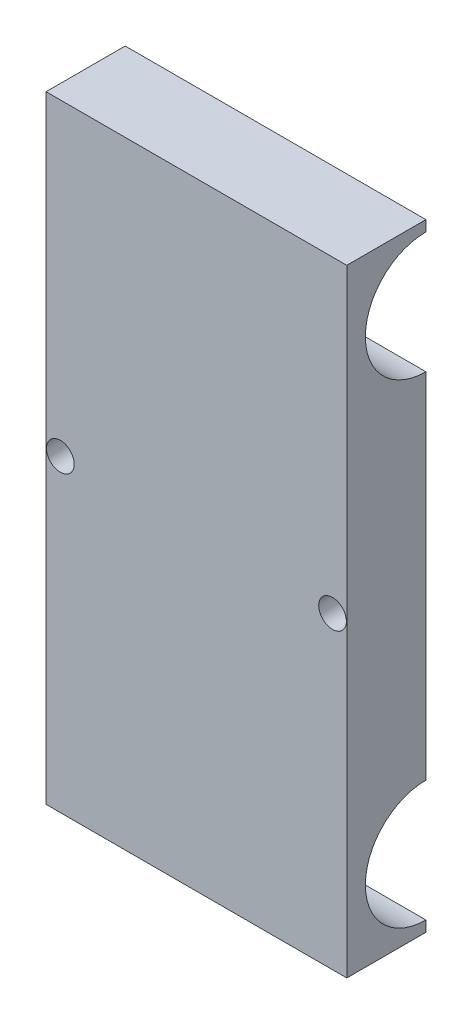
ISO-10303-21;
HEADER;
FILE_DESCRIPTION(('STEP AP214'),'2;1');
FILE_NAME('part.step','',(''),(''),'','','');
FILE_SCHEMA(('AUTOMOTIVE_DESIGN { 1 0 10303 214 1 1 1 1 }'));
ENDSEC;
DATA;
#1=APPLICATION_CONTEXT('core data for automotive mechanical design processes');
#2=APPLICATION_PROTOCOL_DEFINITION('international standard','automotive_design',2000,#1);
#3=PRODUCT_CONTEXT('',#1,'mechanical');
#4=PRODUCT('Part','Part','',(#3));
#5=PRODUCT_RELATED_PRODUCT_CATEGORY('part','',(#4));
#6=PRODUCT_DEFINITION_FORMATION('','',#4);
#7=PRODUCT_DEFINITION_CONTEXT('part definition',#1,'design');
#8=PRODUCT_DEFINITION('design','',#6,#7);
#9=PRODUCT_DEFINITION_SHAPE('','',#8);
#10=(LENGTH_UNIT() NAMED_UNIT(*) SI_UNIT(.MILLI.,.METRE.));
#11=(NAMED_UNIT(*) PLANE_ANGLE_UNIT() SI_UNIT($,.RADIAN.));
#12=(NAMED_UNIT(*) SI_UNIT($,.STERADIAN.) SOLID_ANGLE_UNIT());
#13=UNCERTAINTY_MEASURE_WITH_UNIT(LENGTH_MEASURE(1.E-05),#10,'distance_accuracy_value','');
#14=(GEOMETRIC_REPRESENTATION_CONTEXT(3) GLOBAL_UNCERTAINTY_ASSIGNED_CONTEXT((#13)) GLOBAL_UNIT_ASSIGNED_CONTEXT((#10,
#11,#12)) REPRESENTATION_CONTEXT('',''));
#15=CARTESIAN_POINT('',(0.,0.,0.));
#16=DIRECTION('',(0.,0.,1.));
#17=DIRECTION('',(1.,0.,0.));
#18=AXIS2_PLACEMENT_3D('',#15,#16,#17);
#19=CARTESIAN_POINT('',(0.,0.,0.));
#20=DIRECTION('',(0.,0.,-1.));
#21=DIRECTION('',(-1.,0.,0.));
#22=AXIS2_PLACEMENT_3D('',#19,#20,#21);
#23=PLANE('',#22);
#24=DIRECTION('',(-1.,0.,0.));
#25=VECTOR('',#24,1.);
#26=CARTESIAN_POINT('',(38.,1.35,0.));
#27=LINE('',#26,#25);
#28=CARTESIAN_POINT('',(38.,1.35,0.));
#29=VERTEX_POINT('',#28);
#30=CARTESIAN_POINT('',(0.,1.35,0.));
#31=VERTEX_POINT('',#30);
#32=EDGE_CURVE('E96',#29,#31,#27,.T.);
#33=ORIENTED_EDGE('',*,*,#32,.F.);
#34=DIRECTION('',(0.,1.,0.));
#35=VECTOR('',#34,1.);
#36=CARTESIAN_POINT('',(38.,0.,0.));
#37=LINE('',#36,#35);
#38=CARTESIAN_POINT('',(38.,0.,0.));
#39=VERTEX_POINT('',#38);
#40=EDGE_CURVE('E105',#39,#29,#37,.T.);
#41=ORIENTED_EDGE('',*,*,#40,.F.);
#42=DIRECTION('',(1.,0.,0.));
#43=VECTOR('',#42,1.);
#44=CARTESIAN_POINT('',(0.,0.,0.));
#45=LINE('',#44,#43);
#46=CARTESIAN_POINT('',(0.,0.,0.));
#47=VERTEX_POINT('',#46);
#48=EDGE_CURVE('E120',#47,#39,#45,.T.);
#49=ORIENTED_EDGE('',*,*,#48,.F.);
#50=DIRECTION('',(0.,-1.,0.));
#51=VECTOR('',#50,1.);
#52=CARTESIAN_POINT('',(0.,0.,0.));
#53=LINE('',#52,#51);
#54=EDGE_CURVE('E106',#31,#47,#53,.T.);
#55=ORIENTED_EDGE('',*,*,#54,.F.);
#56=EDGE_LOOP('',(#33,#41,#49,#55));
#57=FACE_BOUND('',#56,.T.);
#58=ADVANCED_FACE('F33',(#57),#23,.T.);
#59=CARTESIAN_POINT('',(1.8,39.,0.));
#60=DIRECTION('',(0.,0.,-1.));
#61=DIRECTION('',(-1.,0.,0.));
#62=AXIS2_PLACEMENT_3D('',#59,#60,#61);
#63=CIRCLE('',#62,1.75);
#64=CARTESIAN_POINT('',(0.0499999999999962,39.,0.));
#65=VERTEX_POINT('',#64);
#66=EDGE_CURVE('E154',#65,#65,#63,.T.);
#67=ORIENTED_EDGE('',*,*,#66,.F.);
#68=EDGE_LOOP('',(#67));
#69=FACE_BOUND('',#68,.T.);
#70=CARTESIAN_POINT('',(36.2,39.,0.));
#71=DIRECTION('',(0.,0.,-1.));
#72=DIRECTION('',(-1.,0.,0.));
#73=AXIS2_PLACEMENT_3D('',#70,#71,#72);
#74=CIRCLE('',#73,1.75);
#75=CARTESIAN_POINT('',(34.45,39.,0.));
#76=VERTEX_POINT('',#75);
#77=EDGE_CURVE('E148',#76,#76,#74,.T.);
#78=ORIENTED_EDGE('',*,*,#77,.F.);
#79=EDGE_LOOP('',(#78));
#80=FACE_BOUND('',#79,.T.);
#81=DIRECTION('',(-1.,0.,0.));
#82=VECTOR('',#81,1.);
#83=CARTESIAN_POINT('',(38.,16.65,0.));
#84=LINE('',#83,#82);
#85=CARTESIAN_POINT('',(0.,16.65,0.));
#86=VERTEX_POINT('',#85);
#87=CARTESIAN_POINT('',(38.,16.65,0.));
#88=VERTEX_POINT('',#87);
#89=EDGE_CURVE('E48',#86,#88,#84,.F.);
#90=ORIENTED_EDGE('',*,*,#89,.F.);
#91=CARTESIAN_POINT('',(0.,61.35,0.));
#92=VERTEX_POINT('',#91);
#93=EDGE_CURVE('E129',#92,#86,#53,.T.);
#94=ORIENTED_EDGE('',*,*,#93,.F.);
#95=DIRECTION('',(-1.,0.,0.));
#96=VECTOR('',#95,1.);
#97=CARTESIAN_POINT('',(38.,61.35,0.));
#98=LINE('',#97,#96);
#99=CARTESIAN_POINT('',(38.,61.35,0.));
#100=VERTEX_POINT('',#99);
#101=EDGE_CURVE('E41',#100,#92,#98,.T.);
#102=ORIENTED_EDGE('',*,*,#101,.F.);
#103=EDGE_CURVE('E114',#88,#100,#37,.T.);
#104=ORIENTED_EDGE('',*,*,#103,.F.);
#105=EDGE_LOOP('',(#90,#94,#102,#104));
#106=FACE_BOUND('',#105,.T.);
#107=ADVANCED_FACE('F170',(#69,#80,#106),#23,.T.);
#108=CARTESIAN_POINT('',(0.,0.,10.));
#109=DIRECTION('',(1.,0.,0.));
#110=DIRECTION('',(0.,0.,-1.));
#111=AXIS2_PLACEMENT_3D('',#108,#109,#110);
#112=PLANE('',#111);
#113=ORIENTED_EDGE('',*,*,#93,.T.);
#114=CARTESIAN_POINT('',(0.,9.,0.));
#115=DIRECTION('',(-1.,0.,0.));
#116=DIRECTION('',(0.,0.,1.));
#117=AXIS2_PLACEMENT_3D('',#114,#115,#116);
#118=CIRCLE('',#117,7.65);
#119=EDGE_CURVE('E145',#31,#86,#118,.T.);
#120=ORIENTED_EDGE('',*,*,#119,.F.);
#121=ORIENTED_EDGE('',*,*,#54,.T.);
#122=DIRECTION('',(0.,0.,-1.));
#123=VECTOR('',#122,1.);
#124=CARTESIAN_POINT('',(0.,0.,10.));
#125=LINE('',#124,#123);
#126=CARTESIAN_POINT('',(0.,0.,10.));
#127=VERTEX_POINT('',#126);
#128=EDGE_CURVE('E183',#127,#47,#125,.T.);
#129=ORIENTED_EDGE('',*,*,#128,.F.);
#130=DIRECTION('',(0.,-1.,0.));
#131=VECTOR('',#130,1.);
#132=CARTESIAN_POINT('',(0.,0.,10.));
#133=LINE('',#132,#131);
#134=CARTESIAN_POINT('',(0.,78.,10.));
#135=VERTEX_POINT('',#134);
#136=EDGE_CURVE('E117',#135,#127,#133,.T.);
#137=ORIENTED_EDGE('',*,*,#136,.F.);
#138=DIRECTION('',(0.,0.,-1.));
#139=VECTOR('',#138,1.);
#140=CARTESIAN_POINT('',(0.,78.,10.));
#141=LINE('',#140,#139);
#142=CARTESIAN_POINT('',(0.,78.,0.));
#143=VERTEX_POINT('',#142);
#144=EDGE_CURVE('E134',#135,#143,#141,.T.);
#145=ORIENTED_EDGE('',*,*,#144,.T.);
#146=CARTESIAN_POINT('',(0.,76.65,0.));
#147=VERTEX_POINT('',#146);
#148=EDGE_CURVE('E125',#143,#147,#53,.T.);
#149=ORIENTED_EDGE('',*,*,#148,.T.);
#150=CARTESIAN_POINT('',(0.,69.,0.));
#151=DIRECTION('',(-1.,0.,0.));
#152=DIRECTION('',(0.,0.,1.));
#153=AXIS2_PLACEMENT_3D('',#150,#151,#152);
#154=CIRCLE('',#153,7.65);
#155=EDGE_CURVE('E55',#92,#147,#154,.T.);
#156=ORIENTED_EDGE('',*,*,#155,.F.);
#157=EDGE_LOOP('',(#113,#120,#121,#129,#137,#145,#149,#156));
#158=FACE_BOUND('',#157,.T.);
#159=ADVANCED_FACE('F35',(#158),#112,.F.);
#160=CARTESIAN_POINT('',(0.,0.,10.));
#161=DIRECTION('',(0.,1.,0.));
#162=DIRECTION('',(0.,0.,1.));
#163=AXIS2_PLACEMENT_3D('',#160,#161,#162);
#164=PLANE('',#163);
#165=ORIENTED_EDGE('',*,*,#48,.T.);
#166=DIRECTION('',(0.,0.,-1.));
#167=VECTOR('',#166,1.);
#168=CARTESIAN_POINT('',(38.,0.,10.));
#169=LINE('',#168,#167);
#170=CARTESIAN_POINT('',(38.,0.,10.));
#171=VERTEX_POINT('',#170);
#172=EDGE_CURVE('E112',#171,#39,#169,.T.);
#173=ORIENTED_EDGE('',*,*,#172,.F.);
#174=DIRECTION('',(1.,0.,0.));
#175=VECTOR('',#174,1.);
#176=CARTESIAN_POINT('',(0.,0.,10.));
#177=LINE('',#176,#175);
#178=EDGE_CURVE('E137',#127,#171,#177,.T.);
#179=ORIENTED_EDGE('',*,*,#178,.F.);
#180=ORIENTED_EDGE('',*,*,#128,.T.);
#181=EDGE_LOOP('',(#165,#173,#179,#180));
#182=FACE_BOUND('',#181,.T.);
#183=ADVANCED_FACE('F184',(#182),#164,.F.);
#184=CARTESIAN_POINT('',(38.,0.,10.));
#185=DIRECTION('',(-1.,0.,0.));
#186=DIRECTION('',(0.,0.,1.));
#187=AXIS2_PLACEMENT_3D('',#184,#185,#186);
#188=PLANE('',#187);
#189=ORIENTED_EDGE('',*,*,#40,.T.);
#190=CARTESIAN_POINT('',(38.,9.,0.));
#191=DIRECTION('',(-1.,0.,0.));
#192=DIRECTION('',(0.,0.,1.));
#193=AXIS2_PLACEMENT_3D('',#190,#191,#192);
#194=CIRCLE('',#193,7.65);
#195=EDGE_CURVE('E11',#29,#88,#194,.T.);
#196=ORIENTED_EDGE('',*,*,#195,.T.);
#197=ORIENTED_EDGE('',*,*,#103,.T.);
#198=CARTESIAN_POINT('',(38.,69.,0.));
#199=DIRECTION('',(-1.,0.,0.));
#200=DIRECTION('',(0.,0.,1.));
#201=AXIS2_PLACEMENT_3D('',#198,#199,#200);
#202=CIRCLE('',#201,7.65);
#203=CARTESIAN_POINT('',(38.,76.65,0.));
#204=VERTEX_POINT('',#203);
#205=EDGE_CURVE('E142',#100,#204,#202,.T.);
#206=ORIENTED_EDGE('',*,*,#205,.T.);
#207=CARTESIAN_POINT('',(38.,78.,0.));
#208=VERTEX_POINT('',#207);
#209=EDGE_CURVE('E116',#204,#208,#37,.T.);
#210=ORIENTED_EDGE('',*,*,#209,.T.);
#211=DIRECTION('',(0.,0.,-1.));
#212=VECTOR('',#211,1.);
#213=CARTESIAN_POINT('',(38.,78.,10.));
#214=LINE('',#213,#212);
#215=CARTESIAN_POINT('',(38.,78.,10.));
#216=VERTEX_POINT('',#215);
#217=EDGE_CURVE('E188',#216,#208,#214,.T.);
#218=ORIENTED_EDGE('',*,*,#217,.F.);
#219=DIRECTION('',(0.,1.,0.));
#220=VECTOR('',#219,1.);
#221=CARTESIAN_POINT('',(38.,0.,10.));
#222=LINE('',#221,#220);
#223=EDGE_CURVE('E135',#171,#216,#222,.T.);
#224=ORIENTED_EDGE('',*,*,#223,.F.);
#225=ORIENTED_EDGE('',*,*,#172,.T.);
#226=EDGE_LOOP('',(#189,#196,#197,#206,#210,#218,#224,#225));
#227=FACE_BOUND('',#226,.T.);
#228=ADVANCED_FACE('F109',(#227),#188,.F.);
#229=CARTESIAN_POINT('',(0.,78.,10.));
#230=DIRECTION('',(0.,-1.,0.));
#231=DIRECTION('',(0.,0.,-1.));
#232=AXIS2_PLACEMENT_3D('',#229,#230,#231);
#233=PLANE('',#232);
#234=DIRECTION('',(-1.,0.,0.));
#235=VECTOR('',#234,1.);
#236=CARTESIAN_POINT('',(0.,78.,0.));
#237=LINE('',#236,#235);
#238=EDGE_CURVE('E113',#208,#143,#237,.T.);
#239=ORIENTED_EDGE('',*,*,#238,.T.);
#240=ORIENTED_EDGE('',*,*,#144,.F.);
#241=DIRECTION('',(-1.,0.,0.));
#242=VECTOR('',#241,1.);
#243=CARTESIAN_POINT('',(0.,78.,10.));
#244=LINE('',#243,#242);
#245=EDGE_CURVE('E132',#216,#135,#244,.T.);
#246=ORIENTED_EDGE('',*,*,#245,.F.);
#247=ORIENTED_EDGE('',*,*,#217,.T.);
#248=EDGE_LOOP('',(#239,#240,#246,#247));
#249=FACE_BOUND('',#248,.T.);
#250=ADVANCED_FACE('F199',(#249),#233,.F.);
#251=CARTESIAN_POINT('',(0.,0.,10.));
#252=DIRECTION('',(0.,0.,-1.));
#253=DIRECTION('',(-1.,0.,0.));
#254=AXIS2_PLACEMENT_3D('',#251,#252,#253);
#255=PLANE('',#254);
#256=CARTESIAN_POINT('',(1.8,39.,10.));
#257=DIRECTION('',(0.,0.,-1.));
#258=DIRECTION('',(-1.,0.,0.));
#259=AXIS2_PLACEMENT_3D('',#256,#257,#258);
#260=CIRCLE('',#259,1.75);
#261=CARTESIAN_POINT('',(0.0499999999999962,39.,10.));
#262=VERTEX_POINT('',#261);
#263=EDGE_CURVE('E151',#262,#262,#260,.T.);
#264=ORIENTED_EDGE('',*,*,#263,.T.);
#265=EDGE_LOOP('',(#264));
#266=FACE_BOUND('',#265,.T.);
#267=CARTESIAN_POINT('',(36.2,39.,10.));
#268=DIRECTION('',(0.,0.,-1.));
#269=DIRECTION('',(-1.,0.,0.));
#270=AXIS2_PLACEMENT_3D('',#267,#268,#269);
#271=CIRCLE('',#270,1.75);
#272=CARTESIAN_POINT('',(34.45,39.,10.));
#273=VERTEX_POINT('',#272);
#274=EDGE_CURVE('E147',#273,#273,#271,.T.);
#275=ORIENTED_EDGE('',*,*,#274,.T.);
#276=EDGE_LOOP('',(#275));
#277=FACE_BOUND('',#276,.T.);
#278=ORIENTED_EDGE('',*,*,#136,.T.);
#279=ORIENTED_EDGE('',*,*,#178,.T.);
#280=ORIENTED_EDGE('',*,*,#223,.T.);
#281=ORIENTED_EDGE('',*,*,#245,.T.);
#282=EDGE_LOOP('',(#278,#279,#280,#281));
#283=FACE_BOUND('',#282,.T.);
#284=ADVANCED_FACE('F160',(#266,#277,#283),#255,.F.);
#285=DIRECTION('',(-1.,0.,0.));
#286=VECTOR('',#285,1.);
#287=CARTESIAN_POINT('',(38.,76.65,0.));
#288=LINE('',#287,#286);
#289=EDGE_CURVE('E185',#147,#204,#288,.F.);
#290=ORIENTED_EDGE('',*,*,#289,.F.);
#291=ORIENTED_EDGE('',*,*,#148,.F.);
#292=ORIENTED_EDGE('',*,*,#238,.F.);
#293=ORIENTED_EDGE('',*,*,#209,.F.);
#294=EDGE_LOOP('',(#290,#291,#292,#293));
#295=FACE_BOUND('',#294,.T.);
#296=ADVANCED_FACE('F174',(#295),#23,.T.);
#297=CARTESIAN_POINT('',(38.,69.,0.));
#298=DIRECTION('',(-1.,0.,0.));
#299=DIRECTION('',(0.,0.,1.));
#300=AXIS2_PLACEMENT_3D('',#297,#298,#299);
#301=CYLINDRICAL_SURFACE('',#300,7.65);
#302=ORIENTED_EDGE('',*,*,#101,.T.);
#303=ORIENTED_EDGE('',*,*,#155,.T.);
#304=ORIENTED_EDGE('',*,*,#289,.T.);
#305=ORIENTED_EDGE('',*,*,#205,.F.);
#306=EDGE_LOOP('',(#302,#303,#304,#305));
#307=FACE_BOUND('',#306,.T.);
#308=ADVANCED_FACE('F192',(#307),#301,.F.);
#309=CARTESIAN_POINT('',(38.,9.,0.));
#310=DIRECTION('',(-1.,0.,0.));
#311=DIRECTION('',(0.,0.,1.));
#312=AXIS2_PLACEMENT_3D('',#309,#310,#311);
#313=CYLINDRICAL_SURFACE('',#312,7.65);
#314=ORIENTED_EDGE('',*,*,#32,.T.);
#315=ORIENTED_EDGE('',*,*,#119,.T.);
#316=ORIENTED_EDGE('',*,*,#89,.T.);
#317=ORIENTED_EDGE('',*,*,#195,.F.);
#318=EDGE_LOOP('',(#314,#315,#316,#317));
#319=FACE_BOUND('',#318,.T.);
#320=ADVANCED_FACE('F95',(#319),#313,.F.);
#321=CARTESIAN_POINT('',(36.2,39.,10.));
#322=DIRECTION('',(0.,0.,-1.));
#323=DIRECTION('',(-1.,0.,0.));
#324=AXIS2_PLACEMENT_3D('',#321,#322,#323);
#325=CYLINDRICAL_SURFACE('',#324,1.75);
#326=ORIENTED_EDGE('',*,*,#274,.F.);
#327=EDGE_LOOP('',(#326));
#328=FACE_BOUND('',#327,.T.);
#329=ORIENTED_EDGE('',*,*,#77,.T.);
#330=EDGE_LOOP('',(#329));
#331=FACE_BOUND('',#330,.T.);
#332=ADVANCED_FACE('F166',(#328,#331),#325,.F.);
#333=CARTESIAN_POINT('',(1.8,39.,10.));
#334=DIRECTION('',(0.,0.,-1.));
#335=DIRECTION('',(-1.,0.,0.));
#336=AXIS2_PLACEMENT_3D('',#333,#334,#335);
#337=CYLINDRICAL_SURFACE('',#336,1.75);
#338=ORIENTED_EDGE('',*,*,#263,.F.);
#339=EDGE_LOOP('',(#338));
#340=FACE_BOUND('',#339,.T.);
#341=ORIENTED_EDGE('',*,*,#66,.T.);
#342=EDGE_LOOP('',(#341));
#343=FACE_BOUND('',#342,.T.);
#344=ADVANCED_FACE('F163',(#340,#343),#337,.F.);
#345=CLOSED_SHELL('',(#58,#107,#159,#183,#228,#250,#284,#296,#308,#320,#332,#344));
#346=MANIFOLD_SOLID_BREP('B2',#345);
#347=ADVANCED_BREP_SHAPE_REPRESENTATION('',(#18,#346),#14);
#348=SHAPE_DEFINITION_REPRESENTATION(#9,#347);
ENDSEC;
END-ISO-10303-21;
